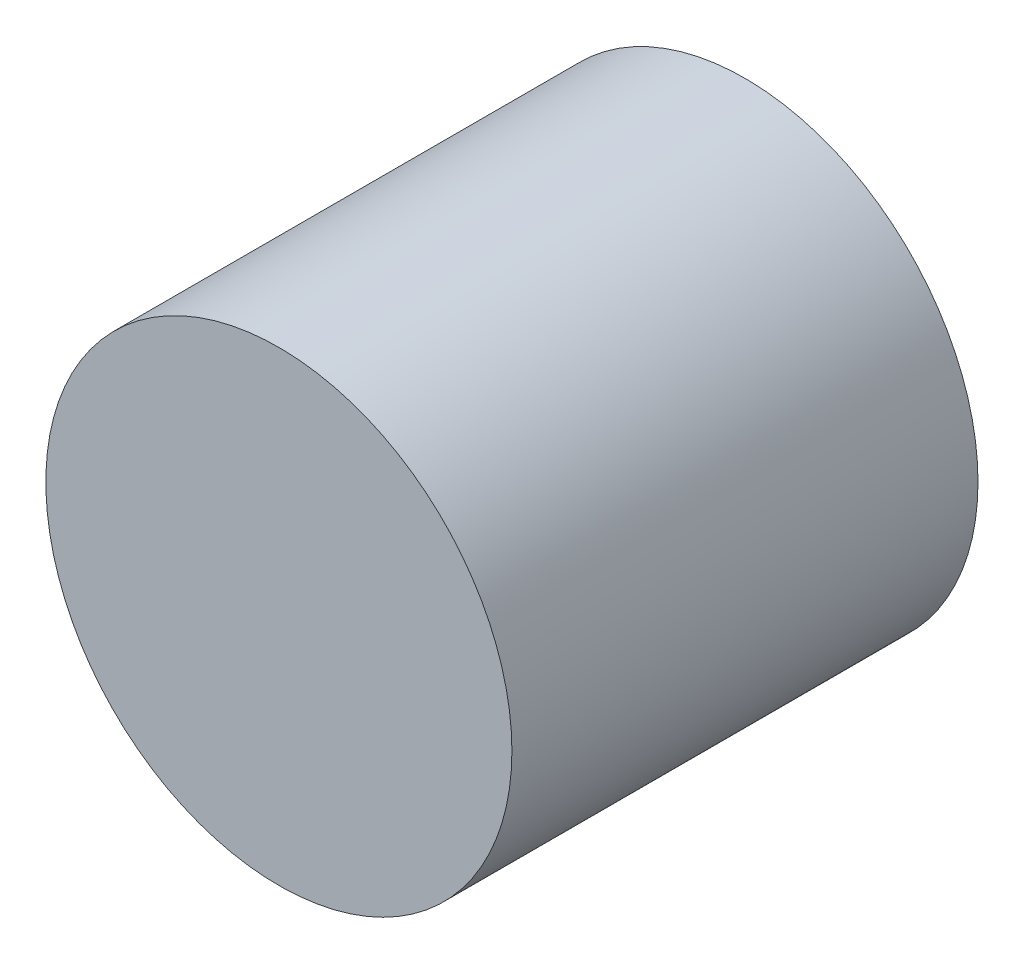
ISO-10303-21;
HEADER;
FILE_DESCRIPTION(('STEP AP214'),'2;1');
FILE_NAME('part.step','',(''),(''),'','','');
FILE_SCHEMA(('AUTOMOTIVE_DESIGN { 1 0 10303 214 1 1 1 1 }'));
ENDSEC;
DATA;
#1=APPLICATION_CONTEXT('core data for automotive mechanical design processes');
#2=APPLICATION_PROTOCOL_DEFINITION('international standard','automotive_design',2000,#1);
#3=PRODUCT_CONTEXT('',#1,'mechanical');
#4=PRODUCT('Part','Part','',(#3));
#5=PRODUCT_RELATED_PRODUCT_CATEGORY('part','',(#4));
#6=PRODUCT_DEFINITION_FORMATION('','',#4);
#7=PRODUCT_DEFINITION_CONTEXT('part definition',#1,'design');
#8=PRODUCT_DEFINITION('design','',#6,#7);
#9=PRODUCT_DEFINITION_SHAPE('','',#8);
#10=(LENGTH_UNIT() NAMED_UNIT(*) SI_UNIT(.MILLI.,.METRE.));
#11=(NAMED_UNIT(*) PLANE_ANGLE_UNIT() SI_UNIT($,.RADIAN.));
#12=(NAMED_UNIT(*) SI_UNIT($,.STERADIAN.) SOLID_ANGLE_UNIT());
#13=UNCERTAINTY_MEASURE_WITH_UNIT(LENGTH_MEASURE(1.E-05),#10,'distance_accuracy_value','');
#14=(GEOMETRIC_REPRESENTATION_CONTEXT(3) GLOBAL_UNCERTAINTY_ASSIGNED_CONTEXT((#13)) GLOBAL_UNIT_ASSIGNED_CONTEXT((#10,
#11,#12)) REPRESENTATION_CONTEXT('',''));
#15=CARTESIAN_POINT('',(0.,0.,0.));
#16=DIRECTION('',(0.,0.,1.));
#17=DIRECTION('',(1.,0.,0.));
#18=AXIS2_PLACEMENT_3D('',#15,#16,#17);
#19=CARTESIAN_POINT('',(0.,0.,250.));
#20=DIRECTION('',(0.,0.,-1.));
#21=DIRECTION('',(-1.,0.,0.));
#22=AXIS2_PLACEMENT_3D('',#19,#20,#21);
#23=CYLINDRICAL_SURFACE('',#22,125.);
#24=CARTESIAN_POINT('',(0.,0.,250.));
#25=DIRECTION('',(0.,0.,1.));
#26=DIRECTION('',(1.,0.,0.));
#27=AXIS2_PLACEMENT_3D('',#24,#25,#26);
#28=CIRCLE('',#27,125.);
#29=CARTESIAN_POINT('',(125.,0.,250.));
#30=VERTEX_POINT('',#29);
#31=EDGE_CURVE('E10',#30,#30,#28,.T.);
#32=ORIENTED_EDGE('',*,*,#31,.F.);
#33=EDGE_LOOP('',(#32));
#34=FACE_BOUND('',#33,.T.);
#35=CARTESIAN_POINT('',(0.,0.,0.));
#36=DIRECTION('',(0.,0.,1.));
#37=DIRECTION('',(1.,0.,0.));
#38=AXIS2_PLACEMENT_3D('',#35,#36,#37);
#39=CIRCLE('',#38,125.);
#40=CARTESIAN_POINT('',(125.,0.,0.));
#41=VERTEX_POINT('',#40);
#42=EDGE_CURVE('E37',#41,#41,#39,.T.);
#43=ORIENTED_EDGE('',*,*,#42,.T.);
#44=EDGE_LOOP('',(#43));
#45=FACE_BOUND('',#44,.T.);
#46=ADVANCED_FACE('F40',(#34,#45),#23,.T.);
#47=CARTESIAN_POINT('',(0.,0.,250.));
#48=DIRECTION('',(0.,0.,1.));
#49=DIRECTION('',(1.,0.,0.));
#50=AXIS2_PLACEMENT_3D('',#47,#48,#49);
#51=PLANE('',#50);
#52=ORIENTED_EDGE('',*,*,#31,.T.);
#53=EDGE_LOOP('',(#52));
#54=FACE_BOUND('',#53,.T.);
#55=ADVANCED_FACE('F55',(#54),#51,.T.);
#56=CARTESIAN_POINT('',(0.,0.,0.));
#57=DIRECTION('',(0.,0.,1.));
#58=DIRECTION('',(1.,0.,0.));
#59=AXIS2_PLACEMENT_3D('',#56,#57,#58);
#60=PLANE('',#59);
#61=ORIENTED_EDGE('',*,*,#42,.F.);
#62=EDGE_LOOP('',(#61));
#63=FACE_BOUND('',#62,.T.);
#64=ADVANCED_FACE('F49',(#63),#60,.F.);
#65=CLOSED_SHELL('',(#46,#55,#64));
#66=MANIFOLD_SOLID_BREP('B2',#65);
#67=ADVANCED_BREP_SHAPE_REPRESENTATION('',(#18,#66),#14);
#68=SHAPE_DEFINITION_REPRESENTATION(#9,#67);
ENDSEC;
END-ISO-10303-21;
